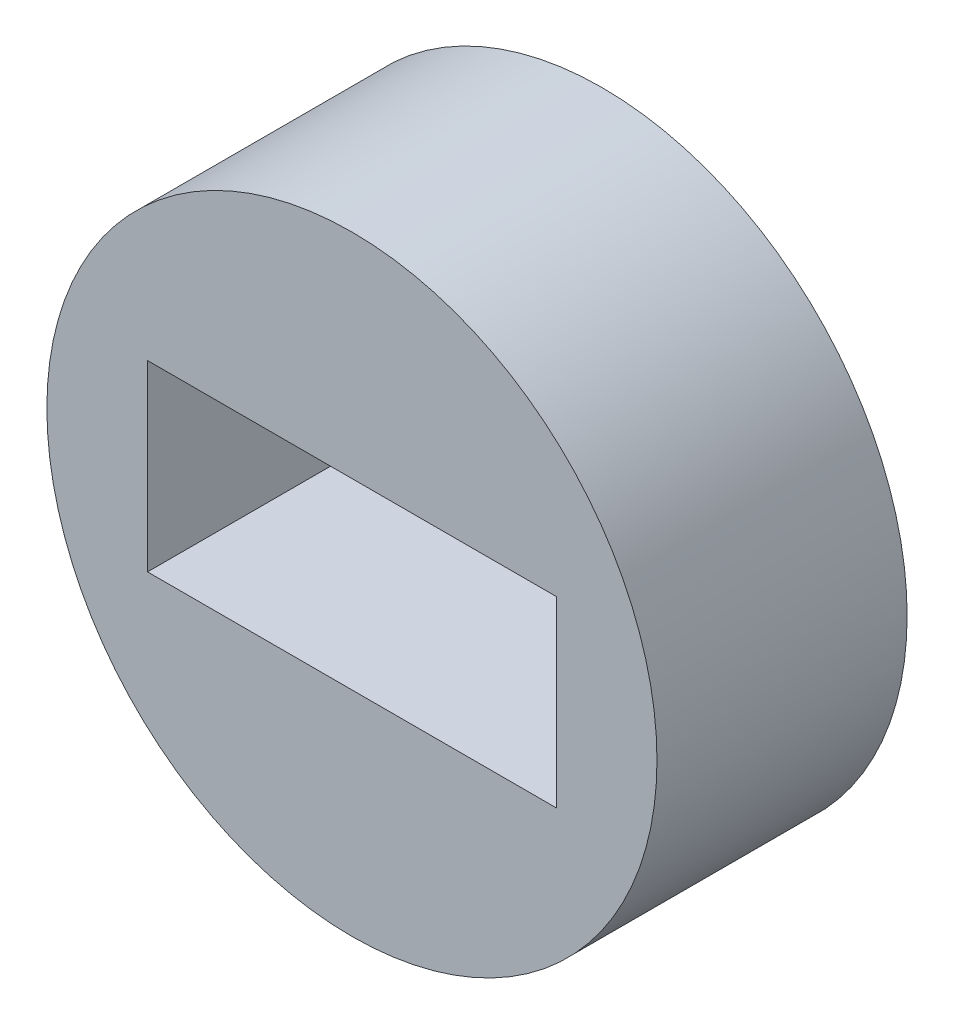
ISO-10303-21;
HEADER;
FILE_DESCRIPTION(('STEP AP214'),'2;1');
FILE_NAME('part.step','',(''),(''),'','','');
FILE_SCHEMA(('AUTOMOTIVE_DESIGN { 1 0 10303 214 1 1 1 1 }'));
ENDSEC;
DATA;
#1=APPLICATION_CONTEXT('core data for automotive mechanical design processes');
#2=APPLICATION_PROTOCOL_DEFINITION('international standard','automotive_design',2000,#1);
#3=PRODUCT_CONTEXT('',#1,'mechanical');
#4=PRODUCT('Part','Part','',(#3));
#5=PRODUCT_RELATED_PRODUCT_CATEGORY('part','',(#4));
#6=PRODUCT_DEFINITION_FORMATION('','',#4);
#7=PRODUCT_DEFINITION_CONTEXT('part definition',#1,'design');
#8=PRODUCT_DEFINITION('design','',#6,#7);
#9=PRODUCT_DEFINITION_SHAPE('','',#8);
#10=(LENGTH_UNIT() NAMED_UNIT(*) SI_UNIT(.MILLI.,.METRE.));
#11=(NAMED_UNIT(*) PLANE_ANGLE_UNIT() SI_UNIT($,.RADIAN.));
#12=(NAMED_UNIT(*) SI_UNIT($,.STERADIAN.) SOLID_ANGLE_UNIT());
#13=UNCERTAINTY_MEASURE_WITH_UNIT(LENGTH_MEASURE(1.E-05),#10,'distance_accuracy_value','');
#14=(GEOMETRIC_REPRESENTATION_CONTEXT(3) GLOBAL_UNCERTAINTY_ASSIGNED_CONTEXT((#13)) GLOBAL_UNIT_ASSIGNED_CONTEXT((#10,
#11,#12)) REPRESENTATION_CONTEXT('',''));
#15=CARTESIAN_POINT('',(0.,0.,0.));
#16=DIRECTION('',(0.,0.,1.));
#17=DIRECTION('',(1.,0.,0.));
#18=AXIS2_PLACEMENT_3D('',#15,#16,#17);
#19=CARTESIAN_POINT('',(0.,0.,41.));
#20=DIRECTION('',(0.,0.,-1.));
#21=DIRECTION('',(-1.,0.,0.));
#22=AXIS2_PLACEMENT_3D('',#19,#20,#21);
#23=CYLINDRICAL_SURFACE('',#22,50.);
#24=CARTESIAN_POINT('',(0.,0.,41.));
#25=DIRECTION('',(0.,0.,1.));
#26=DIRECTION('',(1.,0.,0.));
#27=AXIS2_PLACEMENT_3D('',#24,#25,#26);
#28=CIRCLE('',#27,50.);
#29=CARTESIAN_POINT('',(50.,0.,41.));
#30=VERTEX_POINT('',#29);
#31=EDGE_CURVE('E11',#30,#30,#28,.T.);
#32=ORIENTED_EDGE('',*,*,#31,.F.);
#33=EDGE_LOOP('',(#32));
#34=FACE_BOUND('',#33,.T.);
#35=CARTESIAN_POINT('',(0.,0.,0.));
#36=DIRECTION('',(0.,0.,1.));
#37=DIRECTION('',(1.,0.,0.));
#38=AXIS2_PLACEMENT_3D('',#35,#36,#37);
#39=CIRCLE('',#38,50.);
#40=CARTESIAN_POINT('',(50.,0.,0.));
#41=VERTEX_POINT('',#40);
#42=EDGE_CURVE('E37',#41,#41,#39,.T.);
#43=ORIENTED_EDGE('',*,*,#42,.T.);
#44=EDGE_LOOP('',(#43));
#45=FACE_BOUND('',#44,.T.);
#46=ADVANCED_FACE('F34',(#34,#45),#23,.T.);
#47=CARTESIAN_POINT('',(0.,0.,41.));
#48=DIRECTION('',(0.,0.,1.));
#49=DIRECTION('',(1.,0.,0.));
#50=AXIS2_PLACEMENT_3D('',#47,#48,#49);
#51=PLANE('',#50);
#52=DIRECTION('',(0.,1.,0.));
#53=VECTOR('',#52,1.);
#54=CARTESIAN_POINT('',(33.5,15.,41.));
#55=LINE('',#54,#53);
#56=CARTESIAN_POINT('',(33.5,-15.,41.));
#57=VERTEX_POINT('',#56);
#58=CARTESIAN_POINT('',(33.5,15.,41.));
#59=VERTEX_POINT('',#58);
#60=EDGE_CURVE('E48',#57,#59,#55,.T.);
#61=ORIENTED_EDGE('',*,*,#60,.F.);
#62=DIRECTION('',(1.,0.,0.));
#63=VECTOR('',#62,1.);
#64=CARTESIAN_POINT('',(-33.5,-15.,41.));
#65=LINE('',#64,#63);
#66=CARTESIAN_POINT('',(-33.5,-15.,41.));
#67=VERTEX_POINT('',#66);
#68=EDGE_CURVE('E92',#67,#57,#65,.T.);
#69=ORIENTED_EDGE('',*,*,#68,.F.);
#70=DIRECTION('',(0.,-1.,0.));
#71=VECTOR('',#70,1.);
#72=CARTESIAN_POINT('',(-33.5,15.,41.));
#73=LINE('',#72,#71);
#74=CARTESIAN_POINT('',(-33.5,15.,41.));
#75=VERTEX_POINT('',#74);
#76=EDGE_CURVE('E95',#75,#67,#73,.T.);
#77=ORIENTED_EDGE('',*,*,#76,.F.);
#78=DIRECTION('',(-1.,0.,0.));
#79=VECTOR('',#78,1.);
#80=CARTESIAN_POINT('',(-33.5,15.,41.));
#81=LINE('',#80,#79);
#82=EDGE_CURVE('E101',#59,#75,#81,.T.);
#83=ORIENTED_EDGE('',*,*,#82,.F.);
#84=EDGE_LOOP('',(#61,#69,#77,#83));
#85=FACE_BOUND('',#84,.T.);
#86=ORIENTED_EDGE('',*,*,#31,.T.);
#87=EDGE_LOOP('',(#86));
#88=FACE_BOUND('',#87,.T.);
#89=ADVANCED_FACE('F113',(#85,#88),#51,.T.);
#90=CARTESIAN_POINT('',(0.,0.,0.));
#91=DIRECTION('',(0.,0.,1.));
#92=DIRECTION('',(1.,0.,0.));
#93=AXIS2_PLACEMENT_3D('',#90,#91,#92);
#94=PLANE('',#93);
#95=DIRECTION('',(1.,0.,0.));
#96=VECTOR('',#95,1.);
#97=CARTESIAN_POINT('',(-33.5,-15.,0.));
#98=LINE('',#97,#96);
#99=CARTESIAN_POINT('',(-33.5,-15.,0.));
#100=VERTEX_POINT('',#99);
#101=CARTESIAN_POINT('',(33.5,-15.,0.));
#102=VERTEX_POINT('',#101);
#103=EDGE_CURVE('E82',#100,#102,#98,.T.);
#104=ORIENTED_EDGE('',*,*,#103,.T.);
#105=DIRECTION('',(0.,1.,0.));
#106=VECTOR('',#105,1.);
#107=CARTESIAN_POINT('',(33.5,15.,0.));
#108=LINE('',#107,#106);
#109=CARTESIAN_POINT('',(33.5,15.,0.));
#110=VERTEX_POINT('',#109);
#111=EDGE_CURVE('E76',#102,#110,#108,.T.);
#112=ORIENTED_EDGE('',*,*,#111,.T.);
#113=DIRECTION('',(-1.,0.,0.));
#114=VECTOR('',#113,1.);
#115=CARTESIAN_POINT('',(-33.5,15.,0.));
#116=LINE('',#115,#114);
#117=CARTESIAN_POINT('',(-33.5,15.,0.));
#118=VERTEX_POINT('',#117);
#119=EDGE_CURVE('E85',#110,#118,#116,.T.);
#120=ORIENTED_EDGE('',*,*,#119,.T.);
#121=DIRECTION('',(0.,-1.,0.));
#122=VECTOR('',#121,1.);
#123=CARTESIAN_POINT('',(-33.5,15.,0.));
#124=LINE('',#123,#122);
#125=EDGE_CURVE('E56',#118,#100,#124,.T.);
#126=ORIENTED_EDGE('',*,*,#125,.T.);
#127=EDGE_LOOP('',(#104,#112,#120,#126));
#128=FACE_BOUND('',#127,.T.);
#129=ORIENTED_EDGE('',*,*,#42,.F.);
#130=EDGE_LOOP('',(#129));
#131=FACE_BOUND('',#130,.T.);
#132=ADVANCED_FACE('F89',(#128,#131),#94,.F.);
#133=CARTESIAN_POINT('',(33.5,15.,0.));
#134=DIRECTION('',(1.,0.,0.));
#135=DIRECTION('',(0.,0.,-1.));
#136=AXIS2_PLACEMENT_3D('',#133,#134,#135);
#137=PLANE('',#136);
#138=ORIENTED_EDGE('',*,*,#60,.T.);
#139=DIRECTION('',(0.,0.,1.));
#140=VECTOR('',#139,1.);
#141=CARTESIAN_POINT('',(33.5,15.,0.));
#142=LINE('',#141,#140);
#143=EDGE_CURVE('E72',#110,#59,#142,.T.);
#144=ORIENTED_EDGE('',*,*,#143,.F.);
#145=ORIENTED_EDGE('',*,*,#111,.F.);
#146=DIRECTION('',(0.,0.,1.));
#147=VECTOR('',#146,1.);
#148=CARTESIAN_POINT('',(33.5,-15.,0.));
#149=LINE('',#148,#147);
#150=EDGE_CURVE('E105',#102,#57,#149,.T.);
#151=ORIENTED_EDGE('',*,*,#150,.T.);
#152=EDGE_LOOP('',(#138,#144,#145,#151));
#153=FACE_BOUND('',#152,.T.);
#154=ADVANCED_FACE('F74',(#153),#137,.F.);
#155=CARTESIAN_POINT('',(-33.5,-15.,0.));
#156=DIRECTION('',(0.,-1.,0.));
#157=DIRECTION('',(0.,0.,-1.));
#158=AXIS2_PLACEMENT_3D('',#155,#156,#157);
#159=PLANE('',#158);
#160=ORIENTED_EDGE('',*,*,#68,.T.);
#161=ORIENTED_EDGE('',*,*,#150,.F.);
#162=ORIENTED_EDGE('',*,*,#103,.F.);
#163=DIRECTION('',(0.,0.,1.));
#164=VECTOR('',#163,1.);
#165=CARTESIAN_POINT('',(-33.5,-15.,0.));
#166=LINE('',#165,#164);
#167=EDGE_CURVE('E107',#100,#67,#166,.T.);
#168=ORIENTED_EDGE('',*,*,#167,.T.);
#169=EDGE_LOOP('',(#160,#161,#162,#168));
#170=FACE_BOUND('',#169,.T.);
#171=ADVANCED_FACE('F116',(#170),#159,.F.);
#172=CARTESIAN_POINT('',(-33.5,15.,0.));
#173=DIRECTION('',(-1.,0.,0.));
#174=DIRECTION('',(0.,-1.,0.));
#175=AXIS2_PLACEMENT_3D('',#172,#173,#174);
#176=PLANE('',#175);
#177=ORIENTED_EDGE('',*,*,#76,.T.);
#178=ORIENTED_EDGE('',*,*,#167,.F.);
#179=ORIENTED_EDGE('',*,*,#125,.F.);
#180=DIRECTION('',(0.,0.,1.));
#181=VECTOR('',#180,1.);
#182=CARTESIAN_POINT('',(-33.5,15.,0.));
#183=LINE('',#182,#181);
#184=EDGE_CURVE('E81',#118,#75,#183,.T.);
#185=ORIENTED_EDGE('',*,*,#184,.T.);
#186=EDGE_LOOP('',(#177,#178,#179,#185));
#187=FACE_BOUND('',#186,.T.);
#188=ADVANCED_FACE('F109',(#187),#176,.F.);
#189=CARTESIAN_POINT('',(-33.5,15.,0.));
#190=DIRECTION('',(0.,1.,0.));
#191=DIRECTION('',(0.,0.,1.));
#192=AXIS2_PLACEMENT_3D('',#189,#190,#191);
#193=PLANE('',#192);
#194=ORIENTED_EDGE('',*,*,#82,.T.);
#195=ORIENTED_EDGE('',*,*,#184,.F.);
#196=ORIENTED_EDGE('',*,*,#119,.F.);
#197=ORIENTED_EDGE('',*,*,#143,.T.);
#198=EDGE_LOOP('',(#194,#195,#196,#197));
#199=FACE_BOUND('',#198,.T.);
#200=ADVANCED_FACE('F86',(#199),#193,.F.);
#201=CLOSED_SHELL('',(#46,#89,#132,#154,#171,#188,#200));
#202=MANIFOLD_SOLID_BREP('B2',#201);
#203=ADVANCED_BREP_SHAPE_REPRESENTATION('',(#18,#202),#14);
#204=SHAPE_DEFINITION_REPRESENTATION(#9,#203);
ENDSEC;
END-ISO-10303-21;
